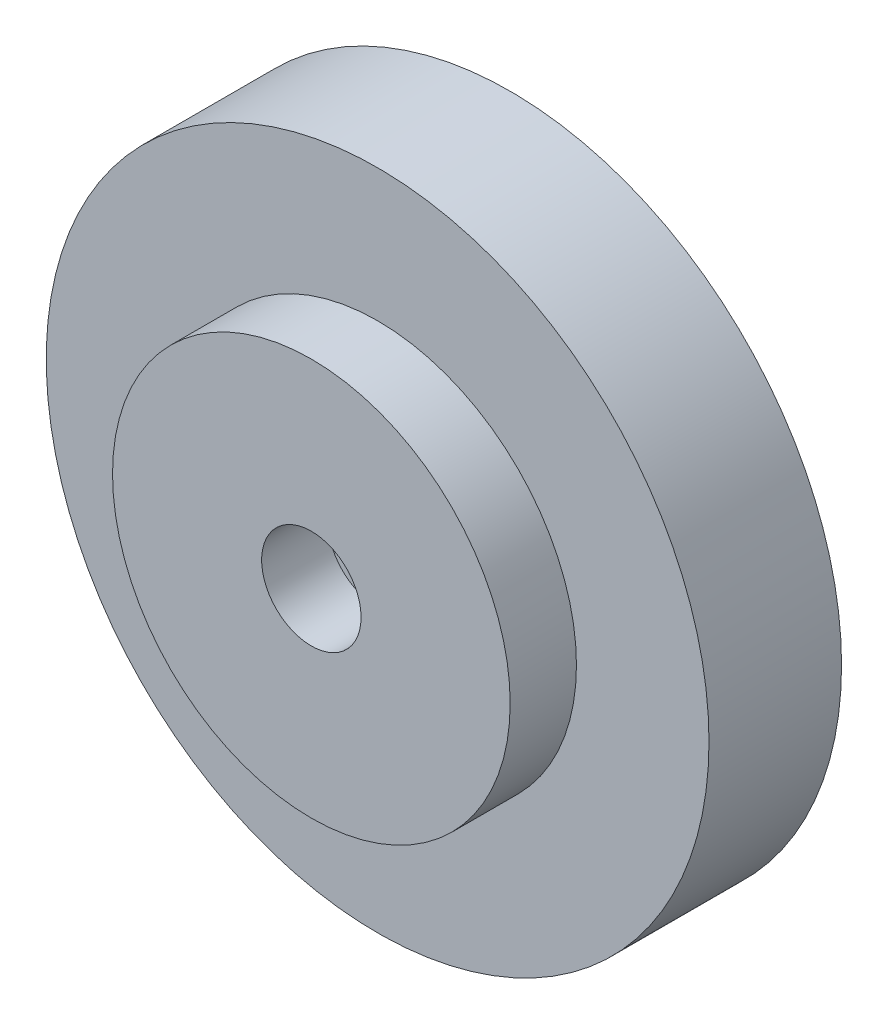
ISO-10303-21;
HEADER;
FILE_DESCRIPTION(('STEP AP214'),'2;1');
FILE_NAME('part.step','',(''),(''),'','','');
FILE_SCHEMA(('AUTOMOTIVE_DESIGN { 1 0 10303 214 1 1 1 1 }'));
ENDSEC;
DATA;
#1=APPLICATION_CONTEXT('core data for automotive mechanical design processes');
#2=APPLICATION_PROTOCOL_DEFINITION('international standard','automotive_design',2000,#1);
#3=PRODUCT_CONTEXT('',#1,'mechanical');
#4=PRODUCT('Part','Part','',(#3));
#5=PRODUCT_RELATED_PRODUCT_CATEGORY('part','',(#4));
#6=PRODUCT_DEFINITION_FORMATION('','',#4);
#7=PRODUCT_DEFINITION_CONTEXT('part definition',#1,'design');
#8=PRODUCT_DEFINITION('design','',#6,#7);
#9=PRODUCT_DEFINITION_SHAPE('','',#8);
#10=(LENGTH_UNIT() NAMED_UNIT(*) SI_UNIT(.MILLI.,.METRE.));
#11=(NAMED_UNIT(*) PLANE_ANGLE_UNIT() SI_UNIT($,.RADIAN.));
#12=(NAMED_UNIT(*) SI_UNIT($,.STERADIAN.) SOLID_ANGLE_UNIT());
#13=UNCERTAINTY_MEASURE_WITH_UNIT(LENGTH_MEASURE(1.E-05),#10,'distance_accuracy_value','');
#14=(GEOMETRIC_REPRESENTATION_CONTEXT(3) GLOBAL_UNCERTAINTY_ASSIGNED_CONTEXT((#13)) GLOBAL_UNIT_ASSIGNED_CONTEXT((#10,
#11,#12)) REPRESENTATION_CONTEXT('',''));
#15=CARTESIAN_POINT('',(0.,0.,0.));
#16=DIRECTION('',(0.,0.,1.));
#17=DIRECTION('',(1.,0.,0.));
#18=AXIS2_PLACEMENT_3D('',#15,#16,#17);
#19=CARTESIAN_POINT('',(0.,0.,20.));
#20=DIRECTION('',(0.,0.,-1.));
#21=DIRECTION('',(-1.,0.,0.));
#22=AXIS2_PLACEMENT_3D('',#19,#20,#21);
#23=CYLINDRICAL_SURFACE('',#22,50.);
#24=CARTESIAN_POINT('',(0.,0.,20.));
#25=DIRECTION('',(0.,0.,1.));
#26=DIRECTION('',(1.,0.,0.));
#27=AXIS2_PLACEMENT_3D('',#24,#25,#26);
#28=CIRCLE('',#27,50.);
#29=CARTESIAN_POINT('',(50.,0.,20.));
#30=VERTEX_POINT('',#29);
#31=EDGE_CURVE('E45',#30,#30,#28,.T.);
#32=ORIENTED_EDGE('',*,*,#31,.F.);
#33=EDGE_LOOP('',(#32));
#34=FACE_BOUND('',#33,.T.);
#35=CARTESIAN_POINT('',(0.,0.,0.));
#36=DIRECTION('',(0.,0.,1.));
#37=DIRECTION('',(1.,0.,0.));
#38=AXIS2_PLACEMENT_3D('',#35,#36,#37);
#39=CIRCLE('',#38,50.);
#40=CARTESIAN_POINT('',(50.,0.,0.));
#41=VERTEX_POINT('',#40);
#42=EDGE_CURVE('E40',#41,#41,#39,.T.);
#43=ORIENTED_EDGE('',*,*,#42,.T.);
#44=EDGE_LOOP('',(#43));
#45=FACE_BOUND('',#44,.T.);
#46=ADVANCED_FACE('F37',(#34,#45),#23,.T.);
#47=CARTESIAN_POINT('',(0.,0.,20.));
#48=DIRECTION('',(0.,0.,1.));
#49=DIRECTION('',(1.,0.,0.));
#50=AXIS2_PLACEMENT_3D('',#47,#48,#49);
#51=PLANE('',#50);
#52=CARTESIAN_POINT('',(0.,0.,20.));
#53=DIRECTION('',(0.,0.,1.));
#54=DIRECTION('',(1.,0.,0.));
#55=AXIS2_PLACEMENT_3D('',#52,#53,#54);
#56=CIRCLE('',#55,30.);
#57=CARTESIAN_POINT('',(30.,0.,20.));
#58=VERTEX_POINT('',#57);
#59=EDGE_CURVE('E10',#58,#58,#56,.T.);
#60=ORIENTED_EDGE('',*,*,#59,.F.);
#61=EDGE_LOOP('',(#60));
#62=FACE_BOUND('',#61,.T.);
#63=ORIENTED_EDGE('',*,*,#31,.T.);
#64=EDGE_LOOP('',(#63));
#65=FACE_BOUND('',#64,.T.);
#66=ADVANCED_FACE('F86',(#62,#65),#51,.T.);
#67=CARTESIAN_POINT('',(0.,0.,0.));
#68=DIRECTION('',(0.,0.,1.));
#69=DIRECTION('',(1.,0.,0.));
#70=AXIS2_PLACEMENT_3D('',#67,#68,#69);
#71=PLANE('',#70);
#72=ORIENTED_EDGE('',*,*,#42,.F.);
#73=EDGE_LOOP('',(#72));
#74=FACE_BOUND('',#73,.T.);
#75=ADVANCED_FACE('F81',(#74),#71,.F.);
#76=CARTESIAN_POINT('',(0.,0.,30.));
#77=DIRECTION('',(0.,0.,-1.));
#78=DIRECTION('',(-1.,0.,0.));
#79=AXIS2_PLACEMENT_3D('',#76,#77,#78);
#80=CYLINDRICAL_SURFACE('',#79,30.);
#81=CARTESIAN_POINT('',(0.,0.,30.));
#82=DIRECTION('',(0.,0.,1.));
#83=DIRECTION('',(1.,0.,0.));
#84=AXIS2_PLACEMENT_3D('',#81,#82,#83);
#85=CIRCLE('',#84,30.);
#86=CARTESIAN_POINT('',(30.,0.,30.));
#87=VERTEX_POINT('',#86);
#88=EDGE_CURVE('E52',#87,#87,#85,.T.);
#89=ORIENTED_EDGE('',*,*,#88,.F.);
#90=EDGE_LOOP('',(#89));
#91=FACE_BOUND('',#90,.T.);
#92=ORIENTED_EDGE('',*,*,#59,.T.);
#93=EDGE_LOOP('',(#92));
#94=FACE_BOUND('',#93,.T.);
#95=ADVANCED_FACE('F76',(#91,#94),#80,.T.);
#96=CARTESIAN_POINT('',(0.,0.,30.));
#97=DIRECTION('',(0.,0.,1.));
#98=DIRECTION('',(1.,0.,0.));
#99=AXIS2_PLACEMENT_3D('',#96,#97,#98);
#100=PLANE('',#99);
#101=CARTESIAN_POINT('',(0.,0.,30.));
#102=DIRECTION('',(0.,0.,1.));
#103=DIRECTION('',(1.,0.,0.));
#104=AXIS2_PLACEMENT_3D('',#101,#102,#103);
#105=CIRCLE('',#104,7.5);
#106=CARTESIAN_POINT('',(7.5,0.,30.));
#107=VERTEX_POINT('',#106);
#108=EDGE_CURVE('E57',#107,#107,#105,.T.);
#109=ORIENTED_EDGE('',*,*,#108,.F.);
#110=EDGE_LOOP('',(#109));
#111=FACE_BOUND('',#110,.T.);
#112=ORIENTED_EDGE('',*,*,#88,.T.);
#113=EDGE_LOOP('',(#112));
#114=FACE_BOUND('',#113,.T.);
#115=ADVANCED_FACE('F70',(#111,#114),#100,.T.);
#116=CARTESIAN_POINT('',(0.,0.,20.));
#117=DIRECTION('',(0.,0.,1.));
#118=DIRECTION('',(1.,0.,0.));
#119=AXIS2_PLACEMENT_3D('',#116,#117,#118);
#120=CYLINDRICAL_SURFACE('',#119,7.5);
#121=CARTESIAN_POINT('',(0.,0.,20.));
#122=DIRECTION('',(0.,0.,1.));
#123=DIRECTION('',(1.,0.,0.));
#124=AXIS2_PLACEMENT_3D('',#121,#122,#123);
#125=CIRCLE('',#124,7.5);
#126=CARTESIAN_POINT('',(7.5,0.,20.));
#127=VERTEX_POINT('',#126);
#128=EDGE_CURVE('E56',#127,#127,#125,.T.);
#129=ORIENTED_EDGE('',*,*,#128,.F.);
#130=EDGE_LOOP('',(#129));
#131=FACE_BOUND('',#130,.T.);
#132=ORIENTED_EDGE('',*,*,#108,.T.);
#133=EDGE_LOOP('',(#132));
#134=FACE_BOUND('',#133,.T.);
#135=ADVANCED_FACE('F67',(#131,#134),#120,.F.);
#136=CARTESIAN_POINT('',(0.,0.,20.));
#137=DIRECTION('',(0.,0.,1.));
#138=DIRECTION('',(1.,0.,0.));
#139=AXIS2_PLACEMENT_3D('',#136,#137,#138);
#140=PLANE('',#139);
#141=ORIENTED_EDGE('',*,*,#128,.T.);
#142=EDGE_LOOP('',(#141));
#143=FACE_BOUND('',#142,.T.);
#144=ADVANCED_FACE('F65',(#143),#140,.T.);
#145=CLOSED_SHELL('',(#46,#66,#75,#95,#115,#135,#144));
#146=MANIFOLD_SOLID_BREP('B2',#145);
#147=ADVANCED_BREP_SHAPE_REPRESENTATION('',(#18,#146),#14);
#148=SHAPE_DEFINITION_REPRESENTATION(#9,#147);
ENDSEC;
END-ISO-10303-21;
